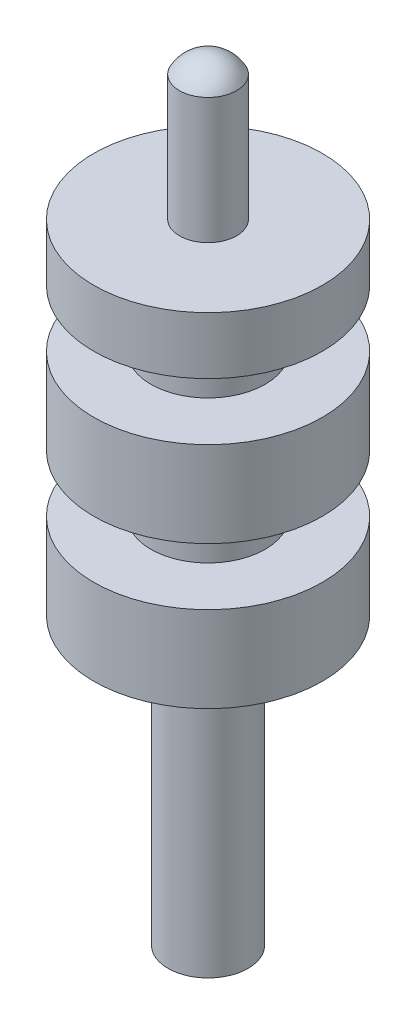
ISO-10303-21;
HEADER;
FILE_DESCRIPTION(('STEP AP214'),'2;1');
FILE_NAME('part.step','',(''),(''),'','','');
FILE_SCHEMA(('AUTOMOTIVE_DESIGN { 1 0 10303 214 1 1 1 1 }'));
ENDSEC;
DATA;
#1=APPLICATION_CONTEXT('core data for automotive mechanical design processes');
#2=APPLICATION_PROTOCOL_DEFINITION('international standard','automotive_design',2000,#1);
#3=PRODUCT_CONTEXT('',#1,'mechanical');
#4=PRODUCT('Part','Part','',(#3));
#5=PRODUCT_RELATED_PRODUCT_CATEGORY('part','',(#4));
#6=PRODUCT_DEFINITION_FORMATION('','',#4);
#7=PRODUCT_DEFINITION_CONTEXT('part definition',#1,'design');
#8=PRODUCT_DEFINITION('design','',#6,#7);
#9=PRODUCT_DEFINITION_SHAPE('','',#8);
#10=(LENGTH_UNIT() NAMED_UNIT(*) SI_UNIT(.MILLI.,.METRE.));
#11=(NAMED_UNIT(*) PLANE_ANGLE_UNIT() SI_UNIT($,.RADIAN.));
#12=(NAMED_UNIT(*) SI_UNIT($,.STERADIAN.) SOLID_ANGLE_UNIT());
#13=UNCERTAINTY_MEASURE_WITH_UNIT(LENGTH_MEASURE(1.E-05),#10,'distance_accuracy_value','');
#14=(GEOMETRIC_REPRESENTATION_CONTEXT(3) GLOBAL_UNCERTAINTY_ASSIGNED_CONTEXT((#13)) GLOBAL_UNIT_ASSIGNED_CONTEXT((#10,
#11,#12)) REPRESENTATION_CONTEXT('',''));
#15=CARTESIAN_POINT('',(0.,0.,0.));
#16=DIRECTION('',(0.,0.,1.));
#17=DIRECTION('',(1.,0.,0.));
#18=AXIS2_PLACEMENT_3D('',#15,#16,#17);
#19=CARTESIAN_POINT('',(0.,0.,0.));
#20=DIRECTION('',(0.,-1.,0.));
#21=DIRECTION('',(1.,0.,0.));
#22=AXIS2_PLACEMENT_3D('',#19,#20,#21);
#23=CYLINDRICAL_SURFACE('',#22,0.699999999999999);
#24=CARTESIAN_POINT('',(0.,0.,0.));
#25=DIRECTION('',(0.,-1.,0.));
#26=DIRECTION('',(1.,0.,0.));
#27=AXIS2_PLACEMENT_3D('',#24,#25,#26);
#28=CIRCLE('',#27,0.699999999999999);
#29=CARTESIAN_POINT('',(0.699999999999999,0.,0.));
#30=VERTEX_POINT('',#29);
#31=EDGE_CURVE('E85',#30,#30,#28,.T.);
#32=ORIENTED_EDGE('',*,*,#31,.F.);
#33=EDGE_LOOP('',(#32));
#34=FACE_BOUND('',#33,.T.);
#35=CARTESIAN_POINT('',(0.,5.,0.));
#36=DIRECTION('',(0.,-1.,0.));
#37=DIRECTION('',(1.,0.,0.));
#38=AXIS2_PLACEMENT_3D('',#35,#36,#37);
#39=CIRCLE('',#38,0.699999999999999);
#40=CARTESIAN_POINT('',(0.699999999999999,5.,0.));
#41=VERTEX_POINT('',#40);
#42=EDGE_CURVE('E11',#41,#41,#39,.T.);
#43=ORIENTED_EDGE('',*,*,#42,.T.);
#44=EDGE_LOOP('',(#43));
#45=FACE_BOUND('',#44,.T.);
#46=ADVANCED_FACE('F41',(#34,#45),#23,.T.);
#47=CARTESIAN_POINT('',(0.,5.,0.));
#48=DIRECTION('',(0.,1.,0.));
#49=DIRECTION('',(-1.,0.,0.));
#50=AXIS2_PLACEMENT_3D('',#47,#48,#49);
#51=PLANE('',#50);
#52=ORIENTED_EDGE('',*,*,#42,.F.);
#53=EDGE_LOOP('',(#52));
#54=FACE_BOUND('',#53,.T.);
#55=CARTESIAN_POINT('',(0.,5.,0.));
#56=DIRECTION('',(0.,-1.,0.));
#57=DIRECTION('',(1.,0.,0.));
#58=AXIS2_PLACEMENT_3D('',#55,#56,#57);
#59=CIRCLE('',#58,2.);
#60=CARTESIAN_POINT('',(2.,5.,0.));
#61=VERTEX_POINT('',#60);
#62=EDGE_CURVE('E49',#61,#61,#59,.T.);
#63=ORIENTED_EDGE('',*,*,#62,.T.);
#64=EDGE_LOOP('',(#63));
#65=FACE_BOUND('',#64,.T.);
#66=ADVANCED_FACE('F110',(#54,#65),#51,.F.);
#67=CARTESIAN_POINT('',(0.,0.,0.));
#68=DIRECTION('',(0.,-1.,0.));
#69=DIRECTION('',(1.,0.,0.));
#70=AXIS2_PLACEMENT_3D('',#67,#68,#69);
#71=CYLINDRICAL_SURFACE('',#70,2.);
#72=ORIENTED_EDGE('',*,*,#62,.F.);
#73=EDGE_LOOP('',(#72));
#74=FACE_BOUND('',#73,.T.);
#75=CARTESIAN_POINT('',(0.,6.5,0.));
#76=DIRECTION('',(0.,-1.,0.));
#77=DIRECTION('',(1.,0.,0.));
#78=AXIS2_PLACEMENT_3D('',#75,#76,#77);
#79=CIRCLE('',#78,2.);
#80=CARTESIAN_POINT('',(2.,6.5,0.));
#81=VERTEX_POINT('',#80);
#82=EDGE_CURVE('E53',#81,#81,#79,.T.);
#83=ORIENTED_EDGE('',*,*,#82,.T.);
#84=EDGE_LOOP('',(#83));
#85=FACE_BOUND('',#84,.T.);
#86=ADVANCED_FACE('F114',(#74,#85),#71,.T.);
#87=CARTESIAN_POINT('',(0.,6.5,0.));
#88=DIRECTION('',(0.,-1.,0.));
#89=DIRECTION('',(1.,0.,0.));
#90=AXIS2_PLACEMENT_3D('',#87,#88,#89);
#91=PLANE('',#90);
#92=ORIENTED_EDGE('',*,*,#82,.F.);
#93=EDGE_LOOP('',(#92));
#94=FACE_BOUND('',#93,.T.);
#95=CARTESIAN_POINT('',(0.,6.5,0.));
#96=DIRECTION('',(0.,-1.,0.));
#97=DIRECTION('',(1.,0.,0.));
#98=AXIS2_PLACEMENT_3D('',#95,#96,#97);
#99=CIRCLE('',#98,1.);
#100=CARTESIAN_POINT('',(1.,6.5,0.));
#101=VERTEX_POINT('',#100);
#102=EDGE_CURVE('E58',#101,#101,#99,.T.);
#103=ORIENTED_EDGE('',*,*,#102,.T.);
#104=EDGE_LOOP('',(#103));
#105=FACE_BOUND('',#104,.T.);
#106=ADVANCED_FACE('F120',(#94,#105),#91,.F.);
#107=CARTESIAN_POINT('',(0.,0.,0.));
#108=DIRECTION('',(0.,-1.,0.));
#109=DIRECTION('',(1.,0.,0.));
#110=AXIS2_PLACEMENT_3D('',#107,#108,#109);
#111=CYLINDRICAL_SURFACE('',#110,1.);
#112=ORIENTED_EDGE('',*,*,#102,.F.);
#113=EDGE_LOOP('',(#112));
#114=FACE_BOUND('',#113,.T.);
#115=CARTESIAN_POINT('',(0.,7.5,0.));
#116=DIRECTION('',(0.,-1.,0.));
#117=DIRECTION('',(1.,0.,0.));
#118=AXIS2_PLACEMENT_3D('',#115,#116,#117);
#119=CIRCLE('',#118,1.);
#120=CARTESIAN_POINT('',(1.,7.5,0.));
#121=VERTEX_POINT('',#120);
#122=EDGE_CURVE('E61',#121,#121,#119,.T.);
#123=ORIENTED_EDGE('',*,*,#122,.T.);
#124=EDGE_LOOP('',(#123));
#125=FACE_BOUND('',#124,.T.);
#126=ADVANCED_FACE('F124',(#114,#125),#111,.T.);
#127=CARTESIAN_POINT('',(0.,7.5,0.));
#128=DIRECTION('',(0.,1.,0.));
#129=DIRECTION('',(-1.,0.,0.));
#130=AXIS2_PLACEMENT_3D('',#127,#128,#129);
#131=PLANE('',#130);
#132=ORIENTED_EDGE('',*,*,#122,.F.);
#133=EDGE_LOOP('',(#132));
#134=FACE_BOUND('',#133,.T.);
#135=CARTESIAN_POINT('',(0.,7.5,0.));
#136=DIRECTION('',(0.,-1.,0.));
#137=DIRECTION('',(1.,0.,0.));
#138=AXIS2_PLACEMENT_3D('',#135,#136,#137);
#139=CIRCLE('',#138,2.);
#140=CARTESIAN_POINT('',(2.,7.5,0.));
#141=VERTEX_POINT('',#140);
#142=EDGE_CURVE('E64',#141,#141,#139,.T.);
#143=ORIENTED_EDGE('',*,*,#142,.T.);
#144=EDGE_LOOP('',(#143));
#145=FACE_BOUND('',#144,.T.);
#146=ADVANCED_FACE('F128',(#134,#145),#131,.F.);
#147=CARTESIAN_POINT('',(0.,0.,0.));
#148=DIRECTION('',(0.,-1.,0.));
#149=DIRECTION('',(1.,0.,0.));
#150=AXIS2_PLACEMENT_3D('',#147,#148,#149);
#151=CYLINDRICAL_SURFACE('',#150,2.);
#152=ORIENTED_EDGE('',*,*,#142,.F.);
#153=EDGE_LOOP('',(#152));
#154=FACE_BOUND('',#153,.T.);
#155=CARTESIAN_POINT('',(0.,9.,0.));
#156=DIRECTION('',(0.,-1.,0.));
#157=DIRECTION('',(1.,0.,0.));
#158=AXIS2_PLACEMENT_3D('',#155,#156,#157);
#159=CIRCLE('',#158,2.);
#160=CARTESIAN_POINT('',(2.,9.,0.));
#161=VERTEX_POINT('',#160);
#162=EDGE_CURVE('E67',#161,#161,#159,.T.);
#163=ORIENTED_EDGE('',*,*,#162,.T.);
#164=EDGE_LOOP('',(#163));
#165=FACE_BOUND('',#164,.T.);
#166=ADVANCED_FACE('F132',(#154,#165),#151,.T.);
#167=CARTESIAN_POINT('',(0.,9.,0.));
#168=DIRECTION('',(0.,-1.,0.));
#169=DIRECTION('',(1.,0.,0.));
#170=AXIS2_PLACEMENT_3D('',#167,#168,#169);
#171=PLANE('',#170);
#172=ORIENTED_EDGE('',*,*,#162,.F.);
#173=EDGE_LOOP('',(#172));
#174=FACE_BOUND('',#173,.T.);
#175=CARTESIAN_POINT('',(0.,9.,0.));
#176=DIRECTION('',(0.,-1.,0.));
#177=DIRECTION('',(1.,0.,0.));
#178=AXIS2_PLACEMENT_3D('',#175,#176,#177);
#179=CIRCLE('',#178,1.);
#180=CARTESIAN_POINT('',(1.,9.,0.));
#181=VERTEX_POINT('',#180);
#182=EDGE_CURVE('E70',#181,#181,#179,.T.);
#183=ORIENTED_EDGE('',*,*,#182,.T.);
#184=EDGE_LOOP('',(#183));
#185=FACE_BOUND('',#184,.T.);
#186=ADVANCED_FACE('F136',(#174,#185),#171,.F.);
#187=CARTESIAN_POINT('',(0.,0.,0.));
#188=DIRECTION('',(0.,-1.,0.));
#189=DIRECTION('',(1.,0.,0.));
#190=AXIS2_PLACEMENT_3D('',#187,#188,#189);
#191=CYLINDRICAL_SURFACE('',#190,1.);
#192=ORIENTED_EDGE('',*,*,#182,.F.);
#193=EDGE_LOOP('',(#192));
#194=FACE_BOUND('',#193,.T.);
#195=CARTESIAN_POINT('',(0.,10.,0.));
#196=DIRECTION('',(0.,-1.,0.));
#197=DIRECTION('',(1.,0.,0.));
#198=AXIS2_PLACEMENT_3D('',#195,#196,#197);
#199=CIRCLE('',#198,1.);
#200=CARTESIAN_POINT('',(1.,10.,0.));
#201=VERTEX_POINT('',#200);
#202=EDGE_CURVE('E73',#201,#201,#199,.T.);
#203=ORIENTED_EDGE('',*,*,#202,.T.);
#204=EDGE_LOOP('',(#203));
#205=FACE_BOUND('',#204,.T.);
#206=ADVANCED_FACE('F140',(#194,#205),#191,.T.);
#207=CARTESIAN_POINT('',(0.,10.,0.));
#208=DIRECTION('',(0.,1.,0.));
#209=DIRECTION('',(-1.,0.,0.));
#210=AXIS2_PLACEMENT_3D('',#207,#208,#209);
#211=PLANE('',#210);
#212=ORIENTED_EDGE('',*,*,#202,.F.);
#213=EDGE_LOOP('',(#212));
#214=FACE_BOUND('',#213,.T.);
#215=CARTESIAN_POINT('',(0.,10.,0.));
#216=DIRECTION('',(0.,-1.,0.));
#217=DIRECTION('',(1.,0.,0.));
#218=AXIS2_PLACEMENT_3D('',#215,#216,#217);
#219=CIRCLE('',#218,2.);
#220=CARTESIAN_POINT('',(2.,10.,0.));
#221=VERTEX_POINT('',#220);
#222=EDGE_CURVE('E76',#221,#221,#219,.T.);
#223=ORIENTED_EDGE('',*,*,#222,.T.);
#224=EDGE_LOOP('',(#223));
#225=FACE_BOUND('',#224,.T.);
#226=ADVANCED_FACE('F144',(#214,#225),#211,.F.);
#227=CARTESIAN_POINT('',(0.,0.,0.));
#228=DIRECTION('',(0.,-1.,0.));
#229=DIRECTION('',(1.,0.,0.));
#230=AXIS2_PLACEMENT_3D('',#227,#228,#229);
#231=CYLINDRICAL_SURFACE('',#230,2.);
#232=ORIENTED_EDGE('',*,*,#222,.F.);
#233=EDGE_LOOP('',(#232));
#234=FACE_BOUND('',#233,.T.);
#235=CARTESIAN_POINT('',(0.,11.,0.));
#236=DIRECTION('',(0.,-1.,0.));
#237=DIRECTION('',(1.,0.,0.));
#238=AXIS2_PLACEMENT_3D('',#235,#236,#237);
#239=CIRCLE('',#238,2.);
#240=CARTESIAN_POINT('',(2.,11.,0.));
#241=VERTEX_POINT('',#240);
#242=EDGE_CURVE('E79',#241,#241,#239,.T.);
#243=ORIENTED_EDGE('',*,*,#242,.T.);
#244=EDGE_LOOP('',(#243));
#245=FACE_BOUND('',#244,.T.);
#246=ADVANCED_FACE('F148',(#234,#245),#231,.T.);
#247=CARTESIAN_POINT('',(0.,11.,0.));
#248=DIRECTION('',(0.,-1.,0.));
#249=DIRECTION('',(1.,0.,0.));
#250=AXIS2_PLACEMENT_3D('',#247,#248,#249);
#251=PLANE('',#250);
#252=ORIENTED_EDGE('',*,*,#242,.F.);
#253=EDGE_LOOP('',(#252));
#254=FACE_BOUND('',#253,.T.);
#255=CARTESIAN_POINT('',(0.,11.,0.));
#256=DIRECTION('',(0.,-1.,0.));
#257=DIRECTION('',(1.,0.,0.));
#258=AXIS2_PLACEMENT_3D('',#255,#256,#257);
#259=CIRCLE('',#258,0.5);
#260=CARTESIAN_POINT('',(0.5,11.,0.));
#261=VERTEX_POINT('',#260);
#262=EDGE_CURVE('E82',#261,#261,#259,.T.);
#263=ORIENTED_EDGE('',*,*,#262,.T.);
#264=EDGE_LOOP('',(#263));
#265=FACE_BOUND('',#264,.T.);
#266=ADVANCED_FACE('F152',(#254,#265),#251,.F.);
#267=CARTESIAN_POINT('',(0.,0.,0.));
#268=DIRECTION('',(0.,-1.,0.));
#269=DIRECTION('',(1.,0.,0.));
#270=AXIS2_PLACEMENT_3D('',#267,#268,#269);
#271=CYLINDRICAL_SURFACE('',#270,0.5);
#272=ORIENTED_EDGE('',*,*,#262,.F.);
#273=EDGE_LOOP('',(#272));
#274=FACE_BOUND('',#273,.T.);
#275=CARTESIAN_POINT('',(0.,13.2,0.));
#276=DIRECTION('',(0.,-1.,0.));
#277=DIRECTION('',(1.,0.,0.));
#278=AXIS2_PLACEMENT_3D('',#275,#276,#277);
#279=CIRCLE('',#278,0.5);
#280=CARTESIAN_POINT('',(0.5,13.2,0.));
#281=VERTEX_POINT('',#280);
#282=EDGE_CURVE('E45',#281,#281,#279,.T.);
#283=ORIENTED_EDGE('',*,*,#282,.T.);
#284=EDGE_LOOP('',(#283));
#285=FACE_BOUND('',#284,.T.);
#286=ADVANCED_FACE('F156',(#274,#285),#271,.T.);
#287=CARTESIAN_POINT('',(0.,12.9333333333333,0.));
#288=DIRECTION('',(0.,0.,1.));
#289=DIRECTION('',(1.,0.,0.));
#290=AXIS2_PLACEMENT_3D('',#287,#288,#289);
#291=SPHERICAL_SURFACE('',#290,0.566666666666667);
#292=CARTESIAN_POINT('',(0.,12.9333333333333,0.));
#293=DIRECTION('',(0.,-1.,0.));
#294=DIRECTION('',(1.,0.,0.));
#295=AXIS2_PLACEMENT_3D('',#292,#293,#294);
#296=SPHERICAL_SURFACE('',#295,0.566666666666667);
#297=ORIENTED_EDGE('',*,*,#282,.F.);
#298=EDGE_LOOP('',(#297));
#299=FACE_BOUND('',#298,.T.);
#300=ADVANCED_FACE('F43',(#299),#296,.T.);
#301=CARTESIAN_POINT('',(0.,0.,0.));
#302=DIRECTION('',(0.,1.,0.));
#303=DIRECTION('',(-1.,0.,0.));
#304=AXIS2_PLACEMENT_3D('',#301,#302,#303);
#305=PLANE('',#304);
#306=CARTESIAN_POINT('',(0.,0.,0.));
#307=DIRECTION('',(0.,-1.,0.));
#308=DIRECTION('',(1.,0.,0.));
#309=AXIS2_PLACEMENT_3D('',#306,#307,#308);
#310=CIRCLE('',#309,0.5);
#311=CARTESIAN_POINT('',(0.5,0.,0.));
#312=VERTEX_POINT('',#311);
#313=EDGE_CURVE('E89',#312,#312,#310,.T.);
#314=ORIENTED_EDGE('',*,*,#313,.F.);
#315=EDGE_LOOP('',(#314));
#316=FACE_BOUND('',#315,.T.);
#317=ORIENTED_EDGE('',*,*,#31,.T.);
#318=EDGE_LOOP('',(#317));
#319=FACE_BOUND('',#318,.T.);
#320=ADVANCED_FACE('F100',(#316,#319),#305,.F.);
#321=CARTESIAN_POINT('',(0.,4.,0.));
#322=DIRECTION('',(0.,-1.,0.));
#323=DIRECTION('',(1.,0.,0.));
#324=AXIS2_PLACEMENT_3D('',#321,#322,#323);
#325=CYLINDRICAL_SURFACE('',#324,0.5);
#326=CARTESIAN_POINT('',(0.,4.,0.));
#327=DIRECTION('',(0.,-1.,0.));
#328=DIRECTION('',(1.,0.,0.));
#329=AXIS2_PLACEMENT_3D('',#326,#327,#328);
#330=CIRCLE('',#329,0.5);
#331=CARTESIAN_POINT('',(0.5,4.,0.));
#332=VERTEX_POINT('',#331);
#333=EDGE_CURVE('E88',#332,#332,#330,.T.);
#334=ORIENTED_EDGE('',*,*,#333,.F.);
#335=EDGE_LOOP('',(#334));
#336=FACE_BOUND('',#335,.T.);
#337=ORIENTED_EDGE('',*,*,#313,.T.);
#338=EDGE_LOOP('',(#337));
#339=FACE_BOUND('',#338,.T.);
#340=ADVANCED_FACE('F97',(#336,#339),#325,.F.);
#341=CARTESIAN_POINT('',(0.,4.,0.));
#342=DIRECTION('',(0.,-1.,0.));
#343=DIRECTION('',(1.,0.,0.));
#344=AXIS2_PLACEMENT_3D('',#341,#342,#343);
#345=PLANE('',#344);
#346=ORIENTED_EDGE('',*,*,#333,.T.);
#347=EDGE_LOOP('',(#346));
#348=FACE_BOUND('',#347,.T.);
#349=ADVANCED_FACE('F95',(#348),#345,.T.);
#350=CLOSED_SHELL('',(#46,#66,#86,#106,#126,#146,#166,#186,#206,#226,#246,#266,#286,#300,#320,
#340,#349));
#351=MANIFOLD_SOLID_BREP('B2',#350);
#352=ADVANCED_BREP_SHAPE_REPRESENTATION('',(#18,#351),#14);
#353=SHAPE_DEFINITION_REPRESENTATION(#9,#352);
ENDSEC;
END-ISO-10303-21;
